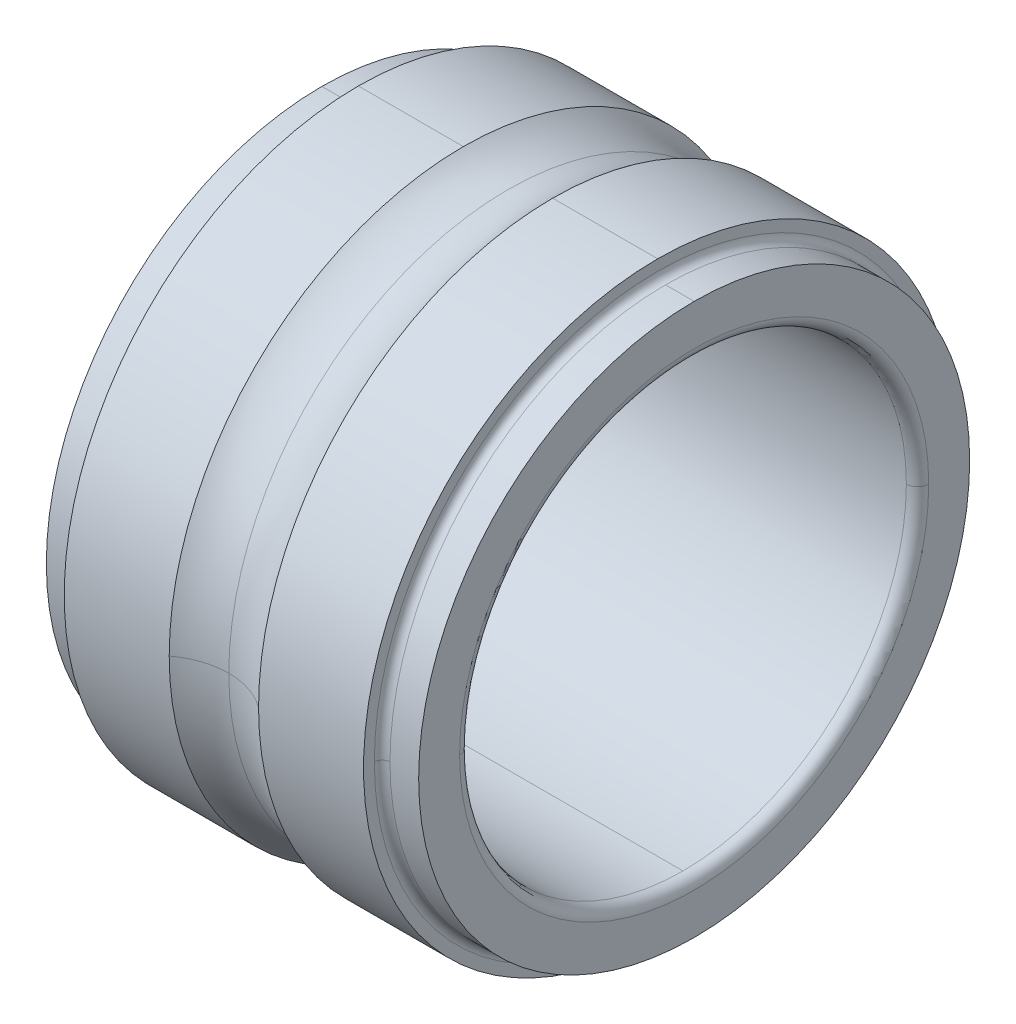
ISO-10303-21;
HEADER;
FILE_DESCRIPTION(('STEP AP214'),'2;1');
FILE_NAME('part.step','',(''),(''),'','','');
FILE_SCHEMA(('AUTOMOTIVE_DESIGN { 1 0 10303 214 1 1 1 1 }'));
ENDSEC;
DATA;
#1=APPLICATION_CONTEXT('core data for automotive mechanical design processes');
#2=APPLICATION_PROTOCOL_DEFINITION('international standard','automotive_design',2000,#1);
#3=PRODUCT_CONTEXT('',#1,'mechanical');
#4=PRODUCT('Part','Part','',(#3));
#5=PRODUCT_RELATED_PRODUCT_CATEGORY('part','',(#4));
#6=PRODUCT_DEFINITION_FORMATION('','',#4);
#7=PRODUCT_DEFINITION_CONTEXT('part definition',#1,'design');
#8=PRODUCT_DEFINITION('design','',#6,#7);
#9=PRODUCT_DEFINITION_SHAPE('','',#8);
#10=(LENGTH_UNIT() NAMED_UNIT(*) SI_UNIT(.MILLI.,.METRE.));
#11=(NAMED_UNIT(*) PLANE_ANGLE_UNIT() SI_UNIT($,.RADIAN.));
#12=(NAMED_UNIT(*) SI_UNIT($,.STERADIAN.) SOLID_ANGLE_UNIT());
#13=UNCERTAINTY_MEASURE_WITH_UNIT(LENGTH_MEASURE(1.E-05),#10,'distance_accuracy_value','');
#14=(GEOMETRIC_REPRESENTATION_CONTEXT(3) GLOBAL_UNCERTAINTY_ASSIGNED_CONTEXT((#13)) GLOBAL_UNIT_ASSIGNED_CONTEXT((#10,
#11,#12)) REPRESENTATION_CONTEXT('',''));
#15=CARTESIAN_POINT('',(0.,0.,0.));
#16=DIRECTION('',(0.,0.,1.));
#17=DIRECTION('',(1.,0.,0.));
#18=AXIS2_PLACEMENT_3D('',#15,#16,#17);
#19=CARTESIAN_POINT('',(3.805,0.,0.));
#20=DIRECTION('',(1.,0.,0.));
#21=DIRECTION('',(0.,1.,0.));
#22=AXIS2_PLACEMENT_3D('',#19,#20,#21);
#23=CYLINDRICAL_SURFACE('',#22,3.95);
#24=DIRECTION('',(1.,0.,0.));
#25=VECTOR('',#24,1.);
#26=CARTESIAN_POINT('',(3.805,3.95,0.));
#27=LINE('',#26,#25);
#28=CARTESIAN_POINT('',(3.1,3.95,0.));
#29=VERTEX_POINT('',#28);
#30=CARTESIAN_POINT('',(4.51,3.95,0.));
#31=VERTEX_POINT('',#30);
#32=EDGE_CURVE('E438',#29,#31,#27,.T.);
#33=ORIENTED_EDGE('',*,*,#32,.T.);
#34=CARTESIAN_POINT('',(4.51,0.,0.));
#35=DIRECTION('',(1.,0.,0.));
#36=DIRECTION('',(0.,1.,0.));
#37=AXIS2_PLACEMENT_3D('',#34,#35,#36);
#38=CIRCLE('',#37,3.95);
#39=CARTESIAN_POINT('',(4.51,-3.95,0.));
#40=VERTEX_POINT('',#39);
#41=EDGE_CURVE('E198',#40,#31,#38,.T.);
#42=ORIENTED_EDGE('',*,*,#41,.F.);
#43=DIRECTION('',(-1.,0.,0.));
#44=VECTOR('',#43,1.);
#45=CARTESIAN_POINT('',(3.805,-3.95,0.));
#46=LINE('',#45,#44);
#47=CARTESIAN_POINT('',(3.1,-3.95,0.));
#48=VERTEX_POINT('',#47);
#49=EDGE_CURVE('E285',#40,#48,#46,.T.);
#50=ORIENTED_EDGE('',*,*,#49,.T.);
#51=CARTESIAN_POINT('',(3.1,0.,0.));
#52=DIRECTION('',(1.,0.,0.));
#53=DIRECTION('',(0.,1.,0.));
#54=AXIS2_PLACEMENT_3D('',#51,#52,#53);
#55=CIRCLE('',#54,3.95);
#56=CARTESIAN_POINT('',(3.1,0.,-3.95));
#57=VERTEX_POINT('',#56);
#58=EDGE_CURVE('E297',#48,#57,#55,.T.);
#59=ORIENTED_EDGE('',*,*,#58,.T.);
#60=CARTESIAN_POINT('',(3.1,0.,0.));
#61=DIRECTION('',(1.,0.,0.));
#62=DIRECTION('',(0.,1.,0.));
#63=AXIS2_PLACEMENT_3D('',#60,#61,#62);
#64=CIRCLE('',#63,3.95);
#65=EDGE_CURVE('E294',#57,#29,#64,.T.);
#66=ORIENTED_EDGE('',*,*,#65,.T.);
#67=EDGE_LOOP('',(#33,#42,#50,#59,#66));
#68=FACE_BOUND('',#67,.T.);
#69=ADVANCED_FACE('F16',(#68),#23,.T.);
#70=CARTESIAN_POINT('',(2.5,0.,0.));
#71=DIRECTION('',(1.,0.,0.));
#72=DIRECTION('',(0.,0.,-1.));
#73=AXIS2_PLACEMENT_3D('',#70,#71,#72);
#74=TOROIDAL_SURFACE('',#73,4.75,1.);
#75=CARTESIAN_POINT('',(2.5,0.,0.));
#76=DIRECTION('',(-1.,0.,0.));
#77=DIRECTION('',(0.,0.,1.));
#78=AXIS2_PLACEMENT_3D('',#75,#76,#77);
#79=CIRCLE('',#78,3.75);
#80=CARTESIAN_POINT('',(2.5,0.,3.75));
#81=VERTEX_POINT('',#80);
#82=CARTESIAN_POINT('',(2.5,0.,-3.75));
#83=VERTEX_POINT('',#82);
#84=EDGE_CURVE('E451',#81,#83,#79,.T.);
#85=ORIENTED_EDGE('',*,*,#84,.T.);
#86=CARTESIAN_POINT('',(2.5,0.,-4.75));
#87=DIRECTION('',(0.,-1.,0.));
#88=DIRECTION('',(0.,0.,-1.));
#89=AXIS2_PLACEMENT_3D('',#86,#87,#88);
#90=CIRCLE('',#89,1.);
#91=CARTESIAN_POINT('',(1.9,0.,-3.95));
#92=VERTEX_POINT('',#91);
#93=EDGE_CURVE('E305',#83,#92,#90,.T.);
#94=ORIENTED_EDGE('',*,*,#93,.T.);
#95=CARTESIAN_POINT('',(1.9,0.,0.));
#96=DIRECTION('',(1.,0.,0.));
#97=DIRECTION('',(0.,1.,0.));
#98=AXIS2_PLACEMENT_3D('',#95,#96,#97);
#99=CIRCLE('',#98,3.95);
#100=CARTESIAN_POINT('',(1.9,3.95,0.));
#101=VERTEX_POINT('',#100);
#102=EDGE_CURVE('E11',#92,#101,#99,.T.);
#103=ORIENTED_EDGE('',*,*,#102,.T.);
#104=CARTESIAN_POINT('',(1.9,0.,0.));
#105=DIRECTION('',(1.,0.,0.));
#106=DIRECTION('',(0.,1.,0.));
#107=AXIS2_PLACEMENT_3D('',#104,#105,#106);
#108=CIRCLE('',#107,3.95);
#109=CARTESIAN_POINT('',(1.9,0.,3.95));
#110=VERTEX_POINT('',#109);
#111=EDGE_CURVE('E189',#101,#110,#108,.T.);
#112=ORIENTED_EDGE('',*,*,#111,.T.);
#113=CARTESIAN_POINT('',(2.5,0.,4.75));
#114=DIRECTION('',(0.,-1.,0.));
#115=DIRECTION('',(0.,0.,1.));
#116=AXIS2_PLACEMENT_3D('',#113,#114,#115);
#117=CIRCLE('',#116,1.);
#118=EDGE_CURVE('E302',#110,#81,#117,.T.);
#119=ORIENTED_EDGE('',*,*,#118,.T.);
#120=EDGE_LOOP('',(#85,#94,#103,#112,#119));
#121=FACE_BOUND('',#120,.T.);
#122=ADVANCED_FACE('F18',(#121),#74,.F.);
#123=CARTESIAN_POINT('',(1.195,0.,0.));
#124=DIRECTION('',(1.,0.,0.));
#125=DIRECTION('',(0.,1.,0.));
#126=AXIS2_PLACEMENT_3D('',#123,#124,#125);
#127=CYLINDRICAL_SURFACE('',#126,3.95);
#128=DIRECTION('',(1.,0.,0.));
#129=VECTOR('',#128,1.);
#130=CARTESIAN_POINT('',(1.195,3.95,0.));
#131=LINE('',#130,#129);
#132=CARTESIAN_POINT('',(0.49,3.95,0.));
#133=VERTEX_POINT('',#132);
#134=EDGE_CURVE('E308',#133,#101,#131,.T.);
#135=ORIENTED_EDGE('',*,*,#134,.T.);
#136=ORIENTED_EDGE('',*,*,#102,.F.);
#137=CARTESIAN_POINT('',(1.9,0.,0.));
#138=DIRECTION('',(1.,0.,0.));
#139=DIRECTION('',(0.,1.,0.));
#140=AXIS2_PLACEMENT_3D('',#137,#138,#139);
#141=CIRCLE('',#140,3.95);
#142=CARTESIAN_POINT('',(1.9,-3.95,0.));
#143=VERTEX_POINT('',#142);
#144=EDGE_CURVE('E301',#143,#92,#141,.T.);
#145=ORIENTED_EDGE('',*,*,#144,.F.);
#146=DIRECTION('',(-1.,0.,0.));
#147=VECTOR('',#146,1.);
#148=CARTESIAN_POINT('',(1.195,-3.95,0.));
#149=LINE('',#148,#147);
#150=CARTESIAN_POINT('',(0.49,-3.95,0.));
#151=VERTEX_POINT('',#150);
#152=EDGE_CURVE('E193',#143,#151,#149,.T.);
#153=ORIENTED_EDGE('',*,*,#152,.T.);
#154=CARTESIAN_POINT('',(0.49,0.,0.));
#155=DIRECTION('',(1.,0.,0.));
#156=DIRECTION('',(0.,1.,0.));
#157=AXIS2_PLACEMENT_3D('',#154,#155,#156);
#158=CIRCLE('',#157,3.95);
#159=EDGE_CURVE('E25',#151,#133,#158,.T.);
#160=ORIENTED_EDGE('',*,*,#159,.T.);
#161=EDGE_LOOP('',(#135,#136,#145,#153,#160));
#162=FACE_BOUND('',#161,.T.);
#163=ADVANCED_FACE('F315',(#162),#127,.T.);
#164=CARTESIAN_POINT('',(0.49,3.8775,0.));
#165=DIRECTION('',(-1.,0.,0.));
#166=DIRECTION('',(0.,0.,1.));
#167=AXIS2_PLACEMENT_3D('',#164,#165,#166);
#168=PLANE('',#167);
#169=CARTESIAN_POINT('',(0.49,0.,0.));
#170=DIRECTION('',(1.,0.,0.));
#171=DIRECTION('',(0.,1.,0.));
#172=AXIS2_PLACEMENT_3D('',#169,#170,#171);
#173=CIRCLE('',#172,3.805);
#174=CARTESIAN_POINT('',(0.49,3.805,0.));
#175=VERTEX_POINT('',#174);
#176=CARTESIAN_POINT('',(0.49,0.,3.805));
#177=VERTEX_POINT('',#176);
#178=EDGE_CURVE('E164',#175,#177,#173,.T.);
#179=ORIENTED_EDGE('',*,*,#178,.T.);
#180=CARTESIAN_POINT('',(0.49,0.,0.));
#181=DIRECTION('',(1.,0.,0.));
#182=DIRECTION('',(0.,1.,0.));
#183=AXIS2_PLACEMENT_3D('',#180,#181,#182);
#184=CIRCLE('',#183,3.805);
#185=CARTESIAN_POINT('',(0.49,0.,-3.805));
#186=VERTEX_POINT('',#185);
#187=EDGE_CURVE('E168',#177,#186,#184,.T.);
#188=ORIENTED_EDGE('',*,*,#187,.T.);
#189=CARTESIAN_POINT('',(0.49,0.,0.));
#190=DIRECTION('',(1.,0.,0.));
#191=DIRECTION('',(0.,1.,0.));
#192=AXIS2_PLACEMENT_3D('',#189,#190,#191);
#193=CIRCLE('',#192,3.805);
#194=EDGE_CURVE('E32',#186,#175,#193,.T.);
#195=ORIENTED_EDGE('',*,*,#194,.T.);
#196=EDGE_LOOP('',(#179,#188,#195));
#197=FACE_BOUND('',#196,.T.);
#198=CARTESIAN_POINT('',(0.49,0.,0.));
#199=DIRECTION('',(1.,0.,0.));
#200=DIRECTION('',(0.,1.,0.));
#201=AXIS2_PLACEMENT_3D('',#198,#199,#200);
#202=CIRCLE('',#201,3.95);
#203=EDGE_CURVE('E310',#133,#151,#202,.T.);
#204=ORIENTED_EDGE('',*,*,#203,.F.);
#205=ORIENTED_EDGE('',*,*,#159,.F.);
#206=EDGE_LOOP('',(#204,#205));
#207=FACE_BOUND('',#206,.T.);
#208=ADVANCED_FACE('F166',(#197,#207),#168,.T.);
#209=CARTESIAN_POINT('',(0.385,0.,0.));
#210=DIRECTION('',(1.,0.,0.));
#211=DIRECTION('',(0.,0.,-1.));
#212=AXIS2_PLACEMENT_3D('',#209,#210,#211);
#213=TOROIDAL_SURFACE('',#212,3.805,0.105);
#214=CARTESIAN_POINT('',(0.385,0.,3.805));
#215=DIRECTION('',(0.,-1.,0.));
#216=DIRECTION('',(0.,0.,1.));
#217=AXIS2_PLACEMENT_3D('',#214,#215,#216);
#218=CIRCLE('',#217,0.105);
#219=CARTESIAN_POINT('',(0.385,0.,3.7));
#220=VERTEX_POINT('',#219);
#221=EDGE_CURVE('E178',#220,#177,#218,.T.);
#222=ORIENTED_EDGE('',*,*,#221,.T.);
#223=ORIENTED_EDGE('',*,*,#178,.F.);
#224=ORIENTED_EDGE('',*,*,#194,.F.);
#225=CARTESIAN_POINT('',(0.385,0.,-3.805));
#226=DIRECTION('',(0.,-1.,0.));
#227=DIRECTION('',(0.,0.,-1.));
#228=AXIS2_PLACEMENT_3D('',#225,#226,#227);
#229=CIRCLE('',#228,0.105);
#230=CARTESIAN_POINT('',(0.385,0.,-3.7));
#231=VERTEX_POINT('',#230);
#232=EDGE_CURVE('E181',#186,#231,#229,.T.);
#233=ORIENTED_EDGE('',*,*,#232,.T.);
#234=CARTESIAN_POINT('',(0.385,0.,0.));
#235=DIRECTION('',(1.,0.,0.));
#236=DIRECTION('',(0.,1.,0.));
#237=AXIS2_PLACEMENT_3D('',#234,#235,#236);
#238=CIRCLE('',#237,3.7);
#239=CARTESIAN_POINT('',(0.385,3.7,0.));
#240=VERTEX_POINT('',#239);
#241=EDGE_CURVE('E172',#231,#240,#238,.T.);
#242=ORIENTED_EDGE('',*,*,#241,.T.);
#243=CARTESIAN_POINT('',(0.385,0.,0.));
#244=DIRECTION('',(1.,0.,0.));
#245=DIRECTION('',(0.,1.,0.));
#246=AXIS2_PLACEMENT_3D('',#243,#244,#245);
#247=CIRCLE('',#246,3.7);
#248=EDGE_CURVE('E186',#240,#220,#247,.T.);
#249=ORIENTED_EDGE('',*,*,#248,.T.);
#250=EDGE_LOOP('',(#222,#223,#224,#233,#242,#249));
#251=FACE_BOUND('',#250,.T.);
#252=ADVANCED_FACE('F184',(#251),#213,.F.);
#253=CARTESIAN_POINT('',(0.1925,0.,0.));
#254=DIRECTION('',(1.,0.,0.));
#255=DIRECTION('',(0.,1.,0.));
#256=AXIS2_PLACEMENT_3D('',#253,#254,#255);
#257=CYLINDRICAL_SURFACE('',#256,3.7);
#258=DIRECTION('',(1.,0.,0.));
#259=VECTOR('',#258,1.);
#260=CARTESIAN_POINT('',(0.1925,3.7,0.));
#261=LINE('',#260,#259);
#262=CARTESIAN_POINT('',(0.,3.7,0.));
#263=VERTEX_POINT('',#262);
#264=EDGE_CURVE('E182',#263,#240,#261,.T.);
#265=ORIENTED_EDGE('',*,*,#264,.T.);
#266=ORIENTED_EDGE('',*,*,#241,.F.);
#267=CARTESIAN_POINT('',(0.385,0.,0.));
#268=DIRECTION('',(1.,0.,0.));
#269=DIRECTION('',(0.,1.,0.));
#270=AXIS2_PLACEMENT_3D('',#267,#268,#269);
#271=CIRCLE('',#270,3.7);
#272=CARTESIAN_POINT('',(0.385,-3.7,0.));
#273=VERTEX_POINT('',#272);
#274=EDGE_CURVE('E191',#273,#231,#271,.T.);
#275=ORIENTED_EDGE('',*,*,#274,.F.);
#276=DIRECTION('',(-1.,0.,0.));
#277=VECTOR('',#276,1.);
#278=CARTESIAN_POINT('',(0.1925,-3.7,0.));
#279=LINE('',#278,#277);
#280=CARTESIAN_POINT('',(0.,-3.7,0.));
#281=VERTEX_POINT('',#280);
#282=EDGE_CURVE('E208',#273,#281,#279,.T.);
#283=ORIENTED_EDGE('',*,*,#282,.T.);
#284=CARTESIAN_POINT('',(0.,0.,0.));
#285=DIRECTION('',(1.,0.,0.));
#286=DIRECTION('',(0.,1.,0.));
#287=AXIS2_PLACEMENT_3D('',#284,#285,#286);
#288=CIRCLE('',#287,3.7);
#289=EDGE_CURVE('E276',#281,#263,#288,.T.);
#290=ORIENTED_EDGE('',*,*,#289,.T.);
#291=EDGE_LOOP('',(#265,#266,#275,#283,#290));
#292=FACE_BOUND('',#291,.T.);
#293=ADVANCED_FACE('F328',(#292),#257,.T.);
#294=CARTESIAN_POINT('',(0.,3.425,0.));
#295=DIRECTION('',(-1.,0.,0.));
#296=DIRECTION('',(0.,0.,1.));
#297=AXIS2_PLACEMENT_3D('',#294,#295,#296);
#298=PLANE('',#297);
#299=CARTESIAN_POINT('',(0.,0.,0.));
#300=DIRECTION('',(1.,0.,0.));
#301=DIRECTION('',(0.,1.,0.));
#302=AXIS2_PLACEMENT_3D('',#299,#300,#301);
#303=CIRCLE('',#302,3.15);
#304=CARTESIAN_POINT('',(0.,0.,3.15));
#305=VERTEX_POINT('',#304);
#306=CARTESIAN_POINT('',(0.,0.,-3.15));
#307=VERTEX_POINT('',#306);
#308=EDGE_CURVE('E223',#305,#307,#303,.T.);
#309=ORIENTED_EDGE('',*,*,#308,.T.);
#310=CARTESIAN_POINT('',(0.,0.,0.));
#311=DIRECTION('',(1.,0.,0.));
#312=DIRECTION('',(0.,1.,0.));
#313=AXIS2_PLACEMENT_3D('',#310,#311,#312);
#314=CIRCLE('',#313,3.15);
#315=EDGE_CURVE('E232',#307,#305,#314,.T.);
#316=ORIENTED_EDGE('',*,*,#315,.T.);
#317=EDGE_LOOP('',(#309,#316));
#318=FACE_BOUND('',#317,.T.);
#319=CARTESIAN_POINT('',(0.,0.,0.));
#320=DIRECTION('',(1.,0.,0.));
#321=DIRECTION('',(0.,1.,0.));
#322=AXIS2_PLACEMENT_3D('',#319,#320,#321);
#323=CIRCLE('',#322,3.7);
#324=EDGE_CURVE('E205',#263,#281,#323,.T.);
#325=ORIENTED_EDGE('',*,*,#324,.F.);
#326=ORIENTED_EDGE('',*,*,#289,.F.);
#327=EDGE_LOOP('',(#325,#326));
#328=FACE_BOUND('',#327,.T.);
#329=ADVANCED_FACE('F393',(#318,#328),#298,.T.);
#330=CARTESIAN_POINT('',(0.15,0.,0.));
#331=DIRECTION('',(1.,0.,0.));
#332=DIRECTION('',(0.,0.,-1.));
#333=AXIS2_PLACEMENT_3D('',#330,#331,#332);
#334=TOROIDAL_SURFACE('',#333,3.15,0.15);
#335=CARTESIAN_POINT('',(0.15,0.,-3.15));
#336=DIRECTION('',(0.,-1.,0.));
#337=DIRECTION('',(0.,0.,-1.));
#338=AXIS2_PLACEMENT_3D('',#335,#336,#337);
#339=CIRCLE('',#338,0.15);
#340=CARTESIAN_POINT('',(0.15,0.,-3.));
#341=VERTEX_POINT('',#340);
#342=EDGE_CURVE('E216',#341,#307,#339,.T.);
#343=ORIENTED_EDGE('',*,*,#342,.T.);
#344=ORIENTED_EDGE('',*,*,#308,.F.);
#345=CARTESIAN_POINT('',(0.15,0.,3.15));
#346=DIRECTION('',(0.,-1.,0.));
#347=DIRECTION('',(0.,0.,1.));
#348=AXIS2_PLACEMENT_3D('',#345,#346,#347);
#349=CIRCLE('',#348,0.15);
#350=CARTESIAN_POINT('',(0.15,0.,3.));
#351=VERTEX_POINT('',#350);
#352=EDGE_CURVE('E229',#305,#351,#349,.T.);
#353=ORIENTED_EDGE('',*,*,#352,.T.);
#354=CARTESIAN_POINT('',(0.15,0.,0.));
#355=DIRECTION('',(1.,0.,0.));
#356=DIRECTION('',(0.,1.,0.));
#357=AXIS2_PLACEMENT_3D('',#354,#355,#356);
#358=CIRCLE('',#357,3.);
#359=CARTESIAN_POINT('',(0.15,-3.,0.));
#360=VERTEX_POINT('',#359);
#361=EDGE_CURVE('E218',#351,#360,#358,.T.);
#362=ORIENTED_EDGE('',*,*,#361,.T.);
#363=CARTESIAN_POINT('',(0.15,0.,0.));
#364=DIRECTION('',(1.,0.,0.));
#365=DIRECTION('',(0.,1.,0.));
#366=AXIS2_PLACEMENT_3D('',#363,#364,#365);
#367=CIRCLE('',#366,3.);
#368=EDGE_CURVE('E289',#360,#341,#367,.T.);
#369=ORIENTED_EDGE('',*,*,#368,.T.);
#370=EDGE_LOOP('',(#343,#344,#353,#362,#369));
#371=FACE_BOUND('',#370,.T.);
#372=ADVANCED_FACE('F389',(#371),#334,.T.);
#373=CARTESIAN_POINT('',(2.5,0.,0.));
#374=DIRECTION('',(1.,0.,0.));
#375=DIRECTION('',(0.,1.,0.));
#376=AXIS2_PLACEMENT_3D('',#373,#374,#375);
#377=CYLINDRICAL_SURFACE('',#376,3.);
#378=DIRECTION('',(1.,0.,0.));
#379=VECTOR('',#378,1.);
#380=CARTESIAN_POINT('',(2.5,3.,0.));
#381=LINE('',#380,#379);
#382=CARTESIAN_POINT('',(0.15,3.,0.));
#383=VERTEX_POINT('',#382);
#384=CARTESIAN_POINT('',(4.85,3.,0.));
#385=VERTEX_POINT('',#384);
#386=EDGE_CURVE('E235',#383,#385,#381,.T.);
#387=ORIENTED_EDGE('',*,*,#386,.T.);
#388=CARTESIAN_POINT('',(4.85,0.,0.));
#389=DIRECTION('',(1.,0.,0.));
#390=DIRECTION('',(0.,1.,0.));
#391=AXIS2_PLACEMENT_3D('',#388,#389,#390);
#392=CIRCLE('',#391,3.);
#393=CARTESIAN_POINT('',(4.85,0.,3.));
#394=VERTEX_POINT('',#393);
#395=EDGE_CURVE('E249',#385,#394,#392,.T.);
#396=ORIENTED_EDGE('',*,*,#395,.T.);
#397=CARTESIAN_POINT('',(4.85,0.,0.));
#398=DIRECTION('',(1.,0.,0.));
#399=DIRECTION('',(0.,1.,0.));
#400=AXIS2_PLACEMENT_3D('',#397,#398,#399);
#401=CIRCLE('',#400,3.);
#402=CARTESIAN_POINT('',(4.85,-3.,0.));
#403=VERTEX_POINT('',#402);
#404=EDGE_CURVE('E213',#394,#403,#401,.T.);
#405=ORIENTED_EDGE('',*,*,#404,.T.);
#406=DIRECTION('',(-1.,0.,0.));
#407=VECTOR('',#406,1.);
#408=CARTESIAN_POINT('',(2.5,-3.,0.));
#409=LINE('',#408,#407);
#410=EDGE_CURVE('E240',#403,#360,#409,.T.);
#411=ORIENTED_EDGE('',*,*,#410,.T.);
#412=ORIENTED_EDGE('',*,*,#361,.F.);
#413=CARTESIAN_POINT('',(0.15,0.,0.));
#414=DIRECTION('',(1.,0.,0.));
#415=DIRECTION('',(0.,1.,0.));
#416=AXIS2_PLACEMENT_3D('',#413,#414,#415);
#417=CIRCLE('',#416,3.);
#418=EDGE_CURVE('E226',#383,#351,#417,.T.);
#419=ORIENTED_EDGE('',*,*,#418,.F.);
#420=EDGE_LOOP('',(#387,#396,#405,#411,#412,#419));
#421=FACE_BOUND('',#420,.T.);
#422=ADVANCED_FACE('F360',(#421),#377,.F.);
#423=CARTESIAN_POINT('',(4.85,0.,0.));
#424=DIRECTION('',(1.,0.,0.));
#425=DIRECTION('',(0.,0.,-1.));
#426=AXIS2_PLACEMENT_3D('',#423,#424,#425);
#427=TOROIDAL_SURFACE('',#426,3.15,0.15);
#428=CARTESIAN_POINT('',(4.85,0.,-3.15));
#429=DIRECTION('',(0.,-1.,0.));
#430=DIRECTION('',(0.,0.,-1.));
#431=AXIS2_PLACEMENT_3D('',#428,#429,#430);
#432=CIRCLE('',#431,0.15);
#433=CARTESIAN_POINT('',(5.,0.,-3.15));
#434=VERTEX_POINT('',#433);
#435=CARTESIAN_POINT('',(4.85,0.,-3.));
#436=VERTEX_POINT('',#435);
#437=EDGE_CURVE('E241',#434,#436,#432,.T.);
#438=ORIENTED_EDGE('',*,*,#437,.T.);
#439=CARTESIAN_POINT('',(4.85,0.,0.));
#440=DIRECTION('',(1.,0.,0.));
#441=DIRECTION('',(0.,1.,0.));
#442=AXIS2_PLACEMENT_3D('',#439,#440,#441);
#443=CIRCLE('',#442,3.);
#444=EDGE_CURVE('E236',#403,#436,#443,.T.);
#445=ORIENTED_EDGE('',*,*,#444,.F.);
#446=ORIENTED_EDGE('',*,*,#404,.F.);
#447=CARTESIAN_POINT('',(4.85,0.,3.15));
#448=DIRECTION('',(0.,-1.,0.));
#449=DIRECTION('',(0.,0.,1.));
#450=AXIS2_PLACEMENT_3D('',#447,#448,#449);
#451=CIRCLE('',#450,0.15);
#452=CARTESIAN_POINT('',(5.,0.,3.15));
#453=VERTEX_POINT('',#452);
#454=EDGE_CURVE('E246',#394,#453,#451,.T.);
#455=ORIENTED_EDGE('',*,*,#454,.T.);
#456=CARTESIAN_POINT('',(5.,0.,0.));
#457=DIRECTION('',(1.,0.,0.));
#458=DIRECTION('',(0.,1.,0.));
#459=AXIS2_PLACEMENT_3D('',#456,#457,#458);
#460=CIRCLE('',#459,3.15);
#461=EDGE_CURVE('E211',#453,#434,#460,.T.);
#462=ORIENTED_EDGE('',*,*,#461,.T.);
#463=EDGE_LOOP('',(#438,#445,#446,#455,#462));
#464=FACE_BOUND('',#463,.T.);
#465=ADVANCED_FACE('F356',(#464),#427,.T.);
#466=CARTESIAN_POINT('',(5.,3.425,0.));
#467=DIRECTION('',(1.,0.,0.));
#468=DIRECTION('',(0.,1.,0.));
#469=AXIS2_PLACEMENT_3D('',#466,#467,#468);
#470=PLANE('',#469);
#471=CARTESIAN_POINT('',(5.,0.,0.));
#472=DIRECTION('',(1.,0.,0.));
#473=DIRECTION('',(0.,1.,0.));
#474=AXIS2_PLACEMENT_3D('',#471,#472,#473);
#475=CIRCLE('',#474,3.15);
#476=EDGE_CURVE('E243',#434,#453,#475,.T.);
#477=ORIENTED_EDGE('',*,*,#476,.F.);
#478=ORIENTED_EDGE('',*,*,#461,.F.);
#479=EDGE_LOOP('',(#477,#478));
#480=FACE_BOUND('',#479,.T.);
#481=CARTESIAN_POINT('',(5.,0.,0.));
#482=DIRECTION('',(1.,0.,0.));
#483=DIRECTION('',(0.,1.,0.));
#484=AXIS2_PLACEMENT_3D('',#481,#482,#483);
#485=CIRCLE('',#484,3.7);
#486=CARTESIAN_POINT('',(5.,3.7,0.));
#487=VERTEX_POINT('',#486);
#488=CARTESIAN_POINT('',(5.,-3.7,0.));
#489=VERTEX_POINT('',#488);
#490=EDGE_CURVE('E262',#487,#489,#485,.T.);
#491=ORIENTED_EDGE('',*,*,#490,.T.);
#492=CARTESIAN_POINT('',(5.,0.,0.));
#493=DIRECTION('',(1.,0.,0.));
#494=DIRECTION('',(0.,1.,0.));
#495=AXIS2_PLACEMENT_3D('',#492,#493,#494);
#496=CIRCLE('',#495,3.7);
#497=EDGE_CURVE('E214',#489,#487,#496,.T.);
#498=ORIENTED_EDGE('',*,*,#497,.T.);
#499=EDGE_LOOP('',(#491,#498));
#500=FACE_BOUND('',#499,.T.);
#501=ADVANCED_FACE('F359',(#480,#500),#470,.T.);
#502=CARTESIAN_POINT('',(4.8075,0.,0.));
#503=DIRECTION('',(1.,0.,0.));
#504=DIRECTION('',(0.,1.,0.));
#505=AXIS2_PLACEMENT_3D('',#502,#503,#504);
#506=CYLINDRICAL_SURFACE('',#505,3.7);
#507=DIRECTION('',(1.,0.,0.));
#508=VECTOR('',#507,1.);
#509=CARTESIAN_POINT('',(4.8075,3.7,0.));
#510=LINE('',#509,#508);
#511=CARTESIAN_POINT('',(4.615,3.7,0.));
#512=VERTEX_POINT('',#511);
#513=EDGE_CURVE('E250',#512,#487,#510,.T.);
#514=ORIENTED_EDGE('',*,*,#513,.T.);
#515=ORIENTED_EDGE('',*,*,#497,.F.);
#516=DIRECTION('',(-1.,0.,0.));
#517=VECTOR('',#516,1.);
#518=CARTESIAN_POINT('',(4.8075,-3.7,0.));
#519=LINE('',#518,#517);
#520=CARTESIAN_POINT('',(4.615,-3.7,0.));
#521=VERTEX_POINT('',#520);
#522=EDGE_CURVE('E259',#489,#521,#519,.T.);
#523=ORIENTED_EDGE('',*,*,#522,.T.);
#524=CARTESIAN_POINT('',(4.615,0.,0.));
#525=DIRECTION('',(1.,0.,0.));
#526=DIRECTION('',(0.,1.,0.));
#527=AXIS2_PLACEMENT_3D('',#524,#525,#526);
#528=CIRCLE('',#527,3.7);
#529=CARTESIAN_POINT('',(4.615,0.,-3.7));
#530=VERTEX_POINT('',#529);
#531=EDGE_CURVE('E197',#521,#530,#528,.T.);
#532=ORIENTED_EDGE('',*,*,#531,.T.);
#533=CARTESIAN_POINT('',(4.615,0.,0.));
#534=DIRECTION('',(1.,0.,0.));
#535=DIRECTION('',(0.,1.,0.));
#536=AXIS2_PLACEMENT_3D('',#533,#534,#535);
#537=CIRCLE('',#536,3.7);
#538=EDGE_CURVE('E161',#530,#512,#537,.T.);
#539=ORIENTED_EDGE('',*,*,#538,.T.);
#540=EDGE_LOOP('',(#514,#515,#523,#532,#539));
#541=FACE_BOUND('',#540,.T.);
#542=ADVANCED_FACE('F355',(#541),#506,.T.);
#543=CARTESIAN_POINT('',(4.615,0.,0.));
#544=DIRECTION('',(1.,0.,0.));
#545=DIRECTION('',(0.,0.,-1.));
#546=AXIS2_PLACEMENT_3D('',#543,#544,#545);
#547=TOROIDAL_SURFACE('',#546,3.805,0.105);
#548=CARTESIAN_POINT('',(4.615,0.,3.805));
#549=DIRECTION('',(0.,-1.,0.));
#550=DIRECTION('',(0.,0.,1.));
#551=AXIS2_PLACEMENT_3D('',#548,#549,#550);
#552=CIRCLE('',#551,0.105);
#553=CARTESIAN_POINT('',(4.51,0.,3.805));
#554=VERTEX_POINT('',#553);
#555=CARTESIAN_POINT('',(4.615,0.,3.7));
#556=VERTEX_POINT('',#555);
#557=EDGE_CURVE('E263',#554,#556,#552,.T.);
#558=ORIENTED_EDGE('',*,*,#557,.T.);
#559=CARTESIAN_POINT('',(4.615,0.,0.));
#560=DIRECTION('',(1.,0.,0.));
#561=DIRECTION('',(0.,1.,0.));
#562=AXIS2_PLACEMENT_3D('',#559,#560,#561);
#563=CIRCLE('',#562,3.7);
#564=EDGE_CURVE('E253',#512,#556,#563,.T.);
#565=ORIENTED_EDGE('',*,*,#564,.F.);
#566=ORIENTED_EDGE('',*,*,#538,.F.);
#567=CARTESIAN_POINT('',(4.615,0.,-3.805));
#568=DIRECTION('',(0.,-1.,0.));
#569=DIRECTION('',(0.,0.,-1.));
#570=AXIS2_PLACEMENT_3D('',#567,#568,#569);
#571=CIRCLE('',#570,0.105);
#572=CARTESIAN_POINT('',(4.51,0.,-3.805));
#573=VERTEX_POINT('',#572);
#574=EDGE_CURVE('E199',#530,#573,#571,.T.);
#575=ORIENTED_EDGE('',*,*,#574,.T.);
#576=CARTESIAN_POINT('',(4.51,0.,0.));
#577=DIRECTION('',(1.,0.,0.));
#578=DIRECTION('',(0.,1.,0.));
#579=AXIS2_PLACEMENT_3D('',#576,#577,#578);
#580=CIRCLE('',#579,3.805);
#581=CARTESIAN_POINT('',(4.51,3.805,0.));
#582=VERTEX_POINT('',#581);
#583=EDGE_CURVE('E155',#573,#582,#580,.T.);
#584=ORIENTED_EDGE('',*,*,#583,.T.);
#585=CARTESIAN_POINT('',(4.51,0.,0.));
#586=DIRECTION('',(1.,0.,0.));
#587=DIRECTION('',(0.,1.,0.));
#588=AXIS2_PLACEMENT_3D('',#585,#586,#587);
#589=CIRCLE('',#588,3.805);
#590=EDGE_CURVE('E271',#582,#554,#589,.T.);
#591=ORIENTED_EDGE('',*,*,#590,.T.);
#592=EDGE_LOOP('',(#558,#565,#566,#575,#584,#591));
#593=FACE_BOUND('',#592,.T.);
#594=ADVANCED_FACE('F351',(#593),#547,.F.);
#595=CARTESIAN_POINT('',(4.51,3.8775,0.));
#596=DIRECTION('',(1.,0.,0.));
#597=DIRECTION('',(0.,1.,0.));
#598=AXIS2_PLACEMENT_3D('',#595,#596,#597);
#599=PLANE('',#598);
#600=ORIENTED_EDGE('',*,*,#590,.F.);
#601=ORIENTED_EDGE('',*,*,#583,.F.);
#602=CARTESIAN_POINT('',(4.51,0.,0.));
#603=DIRECTION('',(1.,0.,0.));
#604=DIRECTION('',(0.,1.,0.));
#605=AXIS2_PLACEMENT_3D('',#602,#603,#604);
#606=CIRCLE('',#605,3.805);
#607=EDGE_CURVE('E265',#554,#573,#606,.T.);
#608=ORIENTED_EDGE('',*,*,#607,.F.);
#609=EDGE_LOOP('',(#600,#601,#608));
#610=FACE_BOUND('',#609,.T.);
#611=CARTESIAN_POINT('',(4.51,0.,0.));
#612=DIRECTION('',(1.,0.,0.));
#613=DIRECTION('',(0.,1.,0.));
#614=AXIS2_PLACEMENT_3D('',#611,#612,#613);
#615=CIRCLE('',#614,3.95);
#616=EDGE_CURVE('E430',#31,#40,#615,.T.);
#617=ORIENTED_EDGE('',*,*,#616,.T.);
#618=ORIENTED_EDGE('',*,*,#41,.T.);
#619=EDGE_LOOP('',(#617,#618));
#620=FACE_BOUND('',#619,.T.);
#621=ADVANCED_FACE('F354',(#610,#620),#599,.T.);
#622=CARTESIAN_POINT('',(4.615,0.,0.));
#623=DIRECTION('',(1.,0.,0.));
#624=DIRECTION('',(0.,0.,-1.));
#625=AXIS2_PLACEMENT_3D('',#622,#623,#624);
#626=TOROIDAL_SURFACE('',#625,3.805,0.105);
#627=ORIENTED_EDGE('',*,*,#557,.F.);
#628=ORIENTED_EDGE('',*,*,#607,.T.);
#629=ORIENTED_EDGE('',*,*,#574,.F.);
#630=ORIENTED_EDGE('',*,*,#531,.F.);
#631=CARTESIAN_POINT('',(4.615,0.,0.));
#632=DIRECTION('',(1.,0.,0.));
#633=DIRECTION('',(0.,1.,0.));
#634=AXIS2_PLACEMENT_3D('',#631,#632,#633);
#635=CIRCLE('',#634,3.7);
#636=EDGE_CURVE('E256',#556,#521,#635,.T.);
#637=ORIENTED_EDGE('',*,*,#636,.F.);
#638=EDGE_LOOP('',(#627,#628,#629,#630,#637));
#639=FACE_BOUND('',#638,.T.);
#640=ADVANCED_FACE('F377',(#639),#626,.F.);
#641=CARTESIAN_POINT('',(4.8075,0.,0.));
#642=DIRECTION('',(1.,0.,0.));
#643=DIRECTION('',(0.,1.,0.));
#644=AXIS2_PLACEMENT_3D('',#641,#642,#643);
#645=CYLINDRICAL_SURFACE('',#644,3.7);
#646=ORIENTED_EDGE('',*,*,#513,.F.);
#647=ORIENTED_EDGE('',*,*,#564,.T.);
#648=ORIENTED_EDGE('',*,*,#636,.T.);
#649=ORIENTED_EDGE('',*,*,#522,.F.);
#650=ORIENTED_EDGE('',*,*,#490,.F.);
#651=EDGE_LOOP('',(#646,#647,#648,#649,#650));
#652=FACE_BOUND('',#651,.T.);
#653=ADVANCED_FACE('F373',(#652),#645,.T.);
#654=CARTESIAN_POINT('',(4.85,0.,0.));
#655=DIRECTION('',(1.,0.,0.));
#656=DIRECTION('',(0.,0.,-1.));
#657=AXIS2_PLACEMENT_3D('',#654,#655,#656);
#658=TOROIDAL_SURFACE('',#657,3.15,0.15);
#659=ORIENTED_EDGE('',*,*,#437,.F.);
#660=ORIENTED_EDGE('',*,*,#476,.T.);
#661=ORIENTED_EDGE('',*,*,#454,.F.);
#662=ORIENTED_EDGE('',*,*,#395,.F.);
#663=CARTESIAN_POINT('',(4.85,0.,0.));
#664=DIRECTION('',(1.,0.,0.));
#665=DIRECTION('',(0.,1.,0.));
#666=AXIS2_PLACEMENT_3D('',#663,#664,#665);
#667=CIRCLE('',#666,3.);
#668=EDGE_CURVE('E239',#436,#385,#667,.T.);
#669=ORIENTED_EDGE('',*,*,#668,.F.);
#670=EDGE_LOOP('',(#659,#660,#661,#662,#669));
#671=FACE_BOUND('',#670,.T.);
#672=ADVANCED_FACE('F369',(#671),#658,.T.);
#673=CARTESIAN_POINT('',(2.5,0.,0.));
#674=DIRECTION('',(1.,0.,0.));
#675=DIRECTION('',(0.,1.,0.));
#676=AXIS2_PLACEMENT_3D('',#673,#674,#675);
#677=CYLINDRICAL_SURFACE('',#676,3.);
#678=ORIENTED_EDGE('',*,*,#386,.F.);
#679=CARTESIAN_POINT('',(0.15,0.,0.));
#680=DIRECTION('',(1.,0.,0.));
#681=DIRECTION('',(0.,1.,0.));
#682=AXIS2_PLACEMENT_3D('',#679,#680,#681);
#683=CIRCLE('',#682,3.);
#684=EDGE_CURVE('E221',#341,#383,#683,.T.);
#685=ORIENTED_EDGE('',*,*,#684,.F.);
#686=ORIENTED_EDGE('',*,*,#368,.F.);
#687=ORIENTED_EDGE('',*,*,#410,.F.);
#688=ORIENTED_EDGE('',*,*,#444,.T.);
#689=ORIENTED_EDGE('',*,*,#668,.T.);
#690=EDGE_LOOP('',(#678,#685,#686,#687,#688,#689));
#691=FACE_BOUND('',#690,.T.);
#692=ADVANCED_FACE('F365',(#691),#677,.F.);
#693=CARTESIAN_POINT('',(0.15,0.,0.));
#694=DIRECTION('',(1.,0.,0.));
#695=DIRECTION('',(0.,0.,-1.));
#696=AXIS2_PLACEMENT_3D('',#693,#694,#695);
#697=TOROIDAL_SURFACE('',#696,3.15,0.15);
#698=ORIENTED_EDGE('',*,*,#342,.F.);
#699=ORIENTED_EDGE('',*,*,#684,.T.);
#700=ORIENTED_EDGE('',*,*,#418,.T.);
#701=ORIENTED_EDGE('',*,*,#352,.F.);
#702=ORIENTED_EDGE('',*,*,#315,.F.);
#703=EDGE_LOOP('',(#698,#699,#700,#701,#702));
#704=FACE_BOUND('',#703,.T.);
#705=ADVANCED_FACE('F362',(#704),#697,.T.);
#706=CARTESIAN_POINT('',(0.1925,0.,0.));
#707=DIRECTION('',(1.,0.,0.));
#708=DIRECTION('',(0.,1.,0.));
#709=AXIS2_PLACEMENT_3D('',#706,#707,#708);
#710=CYLINDRICAL_SURFACE('',#709,3.7);
#711=ORIENTED_EDGE('',*,*,#264,.F.);
#712=ORIENTED_EDGE('',*,*,#324,.T.);
#713=ORIENTED_EDGE('',*,*,#282,.F.);
#714=CARTESIAN_POINT('',(0.385,0.,0.));
#715=DIRECTION('',(1.,0.,0.));
#716=DIRECTION('',(0.,1.,0.));
#717=AXIS2_PLACEMENT_3D('',#714,#715,#716);
#718=CIRCLE('',#717,3.7);
#719=EDGE_CURVE('E188',#220,#273,#718,.T.);
#720=ORIENTED_EDGE('',*,*,#719,.F.);
#721=ORIENTED_EDGE('',*,*,#248,.F.);
#722=EDGE_LOOP('',(#711,#712,#713,#720,#721));
#723=FACE_BOUND('',#722,.T.);
#724=ADVANCED_FACE('F350',(#723),#710,.T.);
#725=CARTESIAN_POINT('',(0.385,0.,0.));
#726=DIRECTION('',(1.,0.,0.));
#727=DIRECTION('',(0.,0.,-1.));
#728=AXIS2_PLACEMENT_3D('',#725,#726,#727);
#729=TOROIDAL_SURFACE('',#728,3.805,0.105);
#730=ORIENTED_EDGE('',*,*,#221,.F.);
#731=ORIENTED_EDGE('',*,*,#719,.T.);
#732=ORIENTED_EDGE('',*,*,#274,.T.);
#733=ORIENTED_EDGE('',*,*,#232,.F.);
#734=ORIENTED_EDGE('',*,*,#187,.F.);
#735=EDGE_LOOP('',(#730,#731,#732,#733,#734));
#736=FACE_BOUND('',#735,.T.);
#737=ADVANCED_FACE('F176',(#736),#729,.F.);
#738=CARTESIAN_POINT('',(1.195,0.,0.));
#739=DIRECTION('',(1.,0.,0.));
#740=DIRECTION('',(0.,1.,0.));
#741=AXIS2_PLACEMENT_3D('',#738,#739,#740);
#742=CYLINDRICAL_SURFACE('',#741,3.95);
#743=ORIENTED_EDGE('',*,*,#134,.F.);
#744=ORIENTED_EDGE('',*,*,#203,.T.);
#745=ORIENTED_EDGE('',*,*,#152,.F.);
#746=CARTESIAN_POINT('',(1.9,0.,0.));
#747=DIRECTION('',(1.,0.,0.));
#748=DIRECTION('',(0.,1.,0.));
#749=AXIS2_PLACEMENT_3D('',#746,#747,#748);
#750=CIRCLE('',#749,3.95);
#751=EDGE_CURVE('E298',#110,#143,#750,.T.);
#752=ORIENTED_EDGE('',*,*,#751,.F.);
#753=ORIENTED_EDGE('',*,*,#111,.F.);
#754=EDGE_LOOP('',(#743,#744,#745,#752,#753));
#755=FACE_BOUND('',#754,.T.);
#756=ADVANCED_FACE('F319',(#755),#742,.T.);
#757=CARTESIAN_POINT('',(2.5,0.,0.));
#758=DIRECTION('',(1.,0.,0.));
#759=DIRECTION('',(0.,0.,-1.));
#760=AXIS2_PLACEMENT_3D('',#757,#758,#759);
#761=TOROIDAL_SURFACE('',#760,4.75,1.);
#762=CARTESIAN_POINT('',(2.5,0.,0.));
#763=DIRECTION('',(-1.,0.,0.));
#764=DIRECTION('',(0.,0.,1.));
#765=AXIS2_PLACEMENT_3D('',#762,#763,#764);
#766=CIRCLE('',#765,3.75);
#767=EDGE_CURVE('E293',#83,#81,#766,.T.);
#768=ORIENTED_EDGE('',*,*,#767,.T.);
#769=ORIENTED_EDGE('',*,*,#118,.F.);
#770=ORIENTED_EDGE('',*,*,#751,.T.);
#771=ORIENTED_EDGE('',*,*,#144,.T.);
#772=ORIENTED_EDGE('',*,*,#93,.F.);
#773=EDGE_LOOP('',(#768,#769,#770,#771,#772));
#774=FACE_BOUND('',#773,.T.);
#775=ADVANCED_FACE('F342',(#774),#761,.F.);
#776=CARTESIAN_POINT('',(3.805,0.,0.));
#777=DIRECTION('',(1.,0.,0.));
#778=DIRECTION('',(0.,1.,0.));
#779=AXIS2_PLACEMENT_3D('',#776,#777,#778);
#780=CYLINDRICAL_SURFACE('',#779,3.95);
#781=ORIENTED_EDGE('',*,*,#32,.F.);
#782=CARTESIAN_POINT('',(3.1,0.,0.));
#783=DIRECTION('',(1.,0.,0.));
#784=DIRECTION('',(0.,1.,0.));
#785=AXIS2_PLACEMENT_3D('',#782,#783,#784);
#786=CIRCLE('',#785,3.95);
#787=CARTESIAN_POINT('',(3.1,0.,3.95));
#788=VERTEX_POINT('',#787);
#789=EDGE_CURVE('E443',#29,#788,#786,.T.);
#790=ORIENTED_EDGE('',*,*,#789,.T.);
#791=CARTESIAN_POINT('',(3.1,0.,0.));
#792=DIRECTION('',(1.,0.,0.));
#793=DIRECTION('',(0.,1.,0.));
#794=AXIS2_PLACEMENT_3D('',#791,#792,#793);
#795=CIRCLE('',#794,3.95);
#796=EDGE_CURVE('E436',#788,#48,#795,.T.);
#797=ORIENTED_EDGE('',*,*,#796,.T.);
#798=ORIENTED_EDGE('',*,*,#49,.F.);
#799=ORIENTED_EDGE('',*,*,#616,.F.);
#800=EDGE_LOOP('',(#781,#790,#797,#798,#799));
#801=FACE_BOUND('',#800,.T.);
#802=ADVANCED_FACE('F340',(#801),#780,.T.);
#803=CARTESIAN_POINT('',(2.5,0.,0.));
#804=DIRECTION('',(1.,0.,0.));
#805=DIRECTION('',(0.,0.,-1.));
#806=AXIS2_PLACEMENT_3D('',#803,#804,#805);
#807=TOROIDAL_SURFACE('',#806,4.75,1.);
#808=ORIENTED_EDGE('',*,*,#767,.F.);
#809=CARTESIAN_POINT('',(2.5,0.,-4.75));
#810=DIRECTION('',(0.,-1.,0.));
#811=DIRECTION('',(0.,0.,-1.));
#812=AXIS2_PLACEMENT_3D('',#809,#810,#811);
#813=CIRCLE('',#812,1.);
#814=EDGE_CURVE('E290',#57,#83,#813,.T.);
#815=ORIENTED_EDGE('',*,*,#814,.F.);
#816=ORIENTED_EDGE('',*,*,#58,.F.);
#817=ORIENTED_EDGE('',*,*,#796,.F.);
#818=CARTESIAN_POINT('',(2.5,0.,4.75));
#819=DIRECTION('',(0.,-1.,0.));
#820=DIRECTION('',(0.,0.,1.));
#821=AXIS2_PLACEMENT_3D('',#818,#819,#820);
#822=CIRCLE('',#821,1.);
#823=EDGE_CURVE('E449',#81,#788,#822,.T.);
#824=ORIENTED_EDGE('',*,*,#823,.F.);
#825=EDGE_LOOP('',(#808,#815,#816,#817,#824));
#826=FACE_BOUND('',#825,.T.);
#827=ADVANCED_FACE('F412',(#826),#807,.F.);
#828=CARTESIAN_POINT('',(2.5,0.,0.));
#829=DIRECTION('',(1.,0.,0.));
#830=DIRECTION('',(0.,0.,-1.));
#831=AXIS2_PLACEMENT_3D('',#828,#829,#830);
#832=TOROIDAL_SURFACE('',#831,4.75,1.);
#833=ORIENTED_EDGE('',*,*,#84,.F.);
#834=ORIENTED_EDGE('',*,*,#823,.T.);
#835=ORIENTED_EDGE('',*,*,#789,.F.);
#836=ORIENTED_EDGE('',*,*,#65,.F.);
#837=ORIENTED_EDGE('',*,*,#814,.T.);
#838=EDGE_LOOP('',(#833,#834,#835,#836,#837));
#839=FACE_BOUND('',#838,.T.);
#840=ADVANCED_FACE('F478',(#839),#832,.F.);
#841=CLOSED_SHELL('',(#69,#122,#163,#208,#252,#293,#329,#372,#422,#465,#501,#542,#594,#621,#640,
#653,#672,#692,#705,#724,#737,#756,#775,#802,#827,#840));
#842=MANIFOLD_SOLID_BREP('B1',#841);
#843=ADVANCED_BREP_SHAPE_REPRESENTATION('',(#18,#842),#14);
#844=SHAPE_DEFINITION_REPRESENTATION(#9,#843);
ENDSEC;
END-ISO-10303-21;
